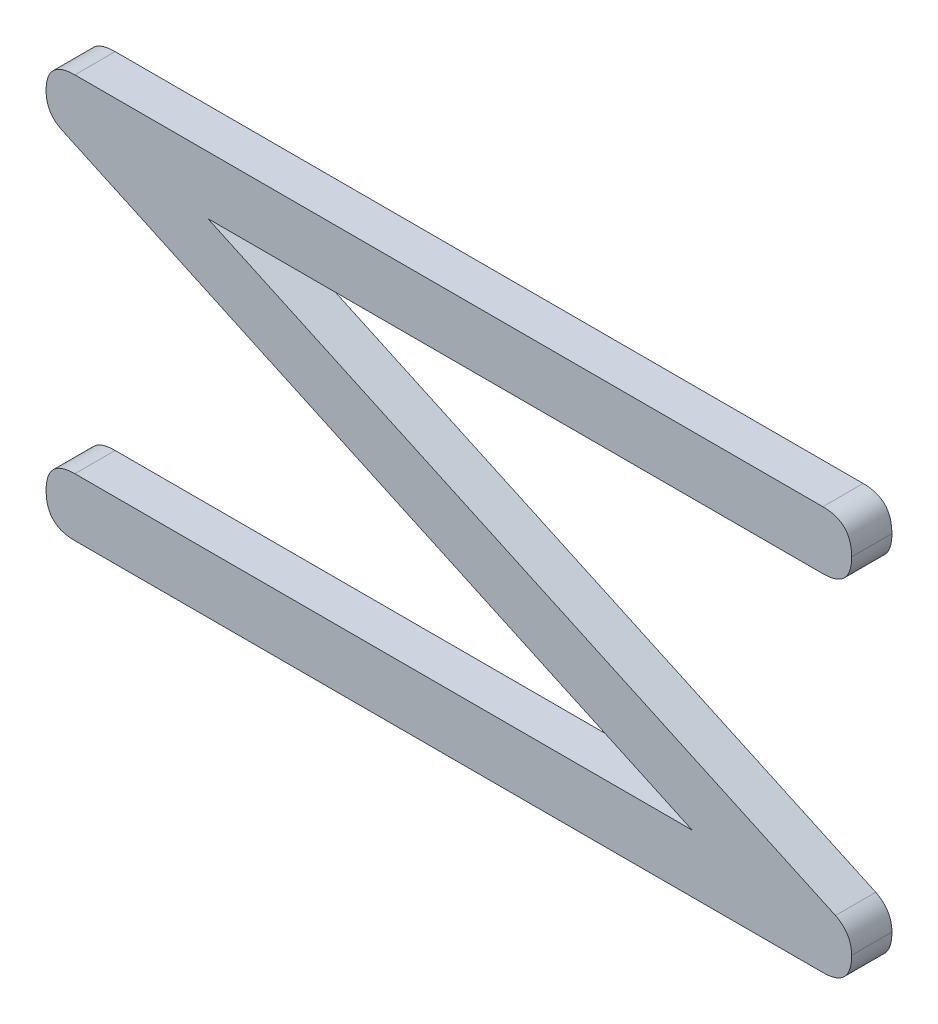
ISO-10303-21;
HEADER;
FILE_DESCRIPTION(('STEP AP214'),'2;1');
FILE_NAME('part.step','',(''),(''),'','','');
FILE_SCHEMA(('AUTOMOTIVE_DESIGN { 1 0 10303 214 1 1 1 1 }'));
ENDSEC;
DATA;
#1=APPLICATION_CONTEXT('core data for automotive mechanical design processes');
#2=APPLICATION_PROTOCOL_DEFINITION('international standard','automotive_design',2000,#1);
#3=PRODUCT_CONTEXT('',#1,'mechanical');
#4=PRODUCT('Part','Part','',(#3));
#5=PRODUCT_RELATED_PRODUCT_CATEGORY('part','',(#4));
#6=PRODUCT_DEFINITION_FORMATION('','',#4);
#7=PRODUCT_DEFINITION_CONTEXT('part definition',#1,'design');
#8=PRODUCT_DEFINITION('design','',#6,#7);
#9=PRODUCT_DEFINITION_SHAPE('','',#8);
#10=(LENGTH_UNIT() NAMED_UNIT(*) SI_UNIT(.MILLI.,.METRE.));
#11=(NAMED_UNIT(*) PLANE_ANGLE_UNIT() SI_UNIT($,.RADIAN.));
#12=(NAMED_UNIT(*) SI_UNIT($,.STERADIAN.) SOLID_ANGLE_UNIT());
#13=UNCERTAINTY_MEASURE_WITH_UNIT(LENGTH_MEASURE(1.E-05),#10,'distance_accuracy_value','');
#14=(GEOMETRIC_REPRESENTATION_CONTEXT(3) GLOBAL_UNCERTAINTY_ASSIGNED_CONTEXT((#13)) GLOBAL_UNIT_ASSIGNED_CONTEXT((#10,
#11,#12)) REPRESENTATION_CONTEXT('',''));
#15=CARTESIAN_POINT('',(0.,0.,0.));
#16=DIRECTION('',(0.,0.,1.));
#17=DIRECTION('',(1.,0.,0.));
#18=AXIS2_PLACEMENT_3D('',#15,#16,#17);
#19=CARTESIAN_POINT('',(0.8,12.2,-2.6));
#20=DIRECTION('',(0.,0.,1.));
#21=DIRECTION('',(1.,0.,0.));
#22=AXIS2_PLACEMENT_3D('',#19,#20,#21);
#23=PLANE('',#22);
#24=CARTESIAN_POINT('',(1.7014,15.6116,-2.6));
#25=CARTESIAN_POINT('',(1.63,15.6116,-2.6));
#26=CARTESIAN_POINT('',(1.63,15.5396,-2.6));
#27=B_SPLINE_CURVE_WITH_KNOTS('',2,(#24,#25,#26),.UNSPECIFIED.,.F.,.F.,(3,3),(0.,1.),.UNSPECIFIED.);
#28=CARTESIAN_POINT('',(1.7014,15.6116,-2.6));
#29=VERTEX_POINT('',#28);
#30=CARTESIAN_POINT('',(1.63,15.5396,-2.6));
#31=VERTEX_POINT('',#30);
#32=EDGE_CURVE('E180',#29,#31,#27,.T.);
#33=ORIENTED_EDGE('',*,*,#32,.T.);
#34=CARTESIAN_POINT('',(1.63,15.5396,-2.6));
#35=CARTESIAN_POINT('',(1.63,15.4676,-2.6));
#36=CARTESIAN_POINT('',(1.70145,15.4676,-2.6));
#37=B_SPLINE_CURVE_WITH_KNOTS('',2,(#34,#35,#36),.UNSPECIFIED.,.F.,.F.,(3,3),(0.,1.),.UNSPECIFIED.);
#38=CARTESIAN_POINT('',(1.70145,15.4676,-2.6));
#39=VERTEX_POINT('',#38);
#40=EDGE_CURVE('E129',#31,#39,#37,.T.);
#41=ORIENTED_EDGE('',*,*,#40,.T.);
#42=DIRECTION('',(1.,0.,0.));
#43=VECTOR('',#42,1.);
#44=CARTESIAN_POINT('',(1.70145,15.4676,-2.6));
#45=LINE('',#44,#43);
#46=CARTESIAN_POINT('',(3.55855,15.4676,-2.6));
#47=VERTEX_POINT('',#46);
#48=EDGE_CURVE('E124',#47,#39,#45,.F.);
#49=ORIENTED_EDGE('',*,*,#48,.F.);
#50=CARTESIAN_POINT('',(3.55855,15.4676,-2.6));
#51=CARTESIAN_POINT('',(3.63,15.4676,-2.6));
#52=CARTESIAN_POINT('',(3.63,15.5404,-2.6));
#53=B_SPLINE_CURVE_WITH_KNOTS('',2,(#50,#51,#52),.UNSPECIFIED.,.F.,.F.,(3,3),(0.,1.),.UNSPECIFIED.);
#54=CARTESIAN_POINT('',(3.63,15.5404,-2.6));
#55=VERTEX_POINT('',#54);
#56=EDGE_CURVE('E112',#47,#55,#53,.T.);
#57=ORIENTED_EDGE('',*,*,#56,.T.);
#58=CARTESIAN_POINT('',(3.63,15.5404,-2.6));
#59=CARTESIAN_POINT('',(3.63,15.58555,-2.6));
#60=CARTESIAN_POINT('',(3.5899,15.60595,-2.6));
#61=B_SPLINE_CURVE_WITH_KNOTS('',2,(#58,#59,#60),.UNSPECIFIED.,.F.,.F.,(3,3),(0.,1.),.UNSPECIFIED.);
#62=CARTESIAN_POINT('',(3.5899,15.60595,-2.6));
#63=VERTEX_POINT('',#62);
#64=EDGE_CURVE('E139',#55,#63,#61,.T.);
#65=ORIENTED_EDGE('',*,*,#64,.T.);
#66=DIRECTION('',(-0.907921004621455,0.419141323860065,0.));
#67=VECTOR('',#66,1.);
#68=CARTESIAN_POINT('',(3.5899,15.60595,-2.6));
#69=LINE('',#68,#67);
#70=CARTESIAN_POINT('',(2.0319,16.3252,-2.6));
#71=VERTEX_POINT('',#70);
#72=EDGE_CURVE('E230',#71,#63,#69,.F.);
#73=ORIENTED_EDGE('',*,*,#72,.F.);
#74=DIRECTION('',(1.,0.,0.));
#75=VECTOR('',#74,1.);
#76=CARTESIAN_POINT('',(2.0319,16.3252,-2.6));
#77=LINE('',#76,#75);
#78=CARTESIAN_POINT('',(3.55885,16.3252,-2.6));
#79=VERTEX_POINT('',#78);
#80=EDGE_CURVE('E227',#79,#71,#77,.F.);
#81=ORIENTED_EDGE('',*,*,#80,.F.);
#82=CARTESIAN_POINT('',(3.55885,16.3252,-2.6));
#83=CARTESIAN_POINT('',(3.63,16.3252,-2.6));
#84=CARTESIAN_POINT('',(3.63,16.3972,-2.6));
#85=B_SPLINE_CURVE_WITH_KNOTS('',2,(#82,#83,#84),.UNSPECIFIED.,.F.,.F.,(3,3),(0.,1.),.UNSPECIFIED.);
#86=CARTESIAN_POINT('',(3.63,16.3972,-2.6));
#87=VERTEX_POINT('',#86);
#88=EDGE_CURVE('E165',#79,#87,#85,.T.);
#89=ORIENTED_EDGE('',*,*,#88,.T.);
#90=CARTESIAN_POINT('',(3.63,16.3972,-2.6));
#91=CARTESIAN_POINT('',(3.63,16.4692,-2.6));
#92=CARTESIAN_POINT('',(3.55855,16.4692,-2.6));
#93=B_SPLINE_CURVE_WITH_KNOTS('',2,(#90,#91,#92),.UNSPECIFIED.,.F.,.F.,(3,3),(0.,1.),.UNSPECIFIED.);
#94=CARTESIAN_POINT('',(3.55855,16.4692,-2.6));
#95=VERTEX_POINT('',#94);
#96=EDGE_CURVE('E169',#87,#95,#93,.T.);
#97=ORIENTED_EDGE('',*,*,#96,.T.);
#98=DIRECTION('',(1.,0.,0.));
#99=VECTOR('',#98,1.);
#100=CARTESIAN_POINT('',(3.55855,16.4692,-2.6));
#101=LINE('',#100,#99);
#102=CARTESIAN_POINT('',(1.70145,16.4692,-2.6));
#103=VERTEX_POINT('',#102);
#104=EDGE_CURVE('E217',#103,#95,#101,.T.);
#105=ORIENTED_EDGE('',*,*,#104,.F.);
#106=CARTESIAN_POINT('',(1.70145,16.4692,-2.6));
#107=CARTESIAN_POINT('',(1.63,16.4692,-2.6));
#108=CARTESIAN_POINT('',(1.63,16.3992,-2.6));
#109=B_SPLINE_CURVE_WITH_KNOTS('',2,(#106,#107,#108),.UNSPECIFIED.,.F.,.F.,(3,3),(0.,1.),.UNSPECIFIED.);
#110=CARTESIAN_POINT('',(1.63,16.3992,-2.6));
#111=VERTEX_POINT('',#110);
#112=EDGE_CURVE('E172',#103,#111,#109,.T.);
#113=ORIENTED_EDGE('',*,*,#112,.T.);
#114=CARTESIAN_POINT('',(1.63,16.3992,-2.6));
#115=CARTESIAN_POINT('',(1.63,16.35205,-2.6));
#116=CARTESIAN_POINT('',(1.6714,16.33345,-2.6));
#117=B_SPLINE_CURVE_WITH_KNOTS('',2,(#114,#115,#116),.UNSPECIFIED.,.F.,.F.,(3,3),(0.,1.),.UNSPECIFIED.);
#118=CARTESIAN_POINT('',(1.6714,16.33345,-2.6));
#119=VERTEX_POINT('',#118);
#120=EDGE_CURVE('E175',#111,#119,#117,.T.);
#121=ORIENTED_EDGE('',*,*,#120,.T.);
#122=DIRECTION('',(0.907820757142358,-0.419358406260655,0.));
#123=VECTOR('',#122,1.);
#124=CARTESIAN_POINT('',(1.6714,16.33345,-2.6));
#125=LINE('',#124,#123);
#126=CARTESIAN_POINT('',(3.23405,15.6116,-2.6));
#127=VERTEX_POINT('',#126);
#128=EDGE_CURVE('E178',#127,#119,#125,.F.);
#129=ORIENTED_EDGE('',*,*,#128,.F.);
#130=DIRECTION('',(1.,0.,0.));
#131=VECTOR('',#130,1.);
#132=CARTESIAN_POINT('',(3.23405,15.6116,-2.6));
#133=LINE('',#132,#131);
#134=EDGE_CURVE('E203',#29,#127,#133,.T.);
#135=ORIENTED_EDGE('',*,*,#134,.F.);
#136=EDGE_LOOP('',(#33,#41,#49,#57,#65,#73,#81,#89,#97,#105,#113,#121,#129,#135));
#137=FACE_BOUND('',#136,.T.);
#138=ADVANCED_FACE('F17',(#137),#23,.T.);
#139=CARTESIAN_POINT('',(3.55855,15.4676,-2.7));
#140=CARTESIAN_POINT('',(3.63,15.4676,-2.7));
#141=CARTESIAN_POINT('',(3.63,15.5404,-2.7));
#142=CARTESIAN_POINT('',(3.55855,15.4676,-2.6));
#143=CARTESIAN_POINT('',(3.63,15.4676,-2.6));
#144=CARTESIAN_POINT('',(3.63,15.5404,-2.6));
#145=B_SPLINE_SURFACE_WITH_KNOTS('',1,2,((#139,#140,#141),(#142,#143,#144)),.UNSPECIFIED.,.F.,
.F.,.F.,(2,2),(3,3),(0.,1.),(0.,1.),.UNSPECIFIED.);
#146=DIRECTION('',(0.,0.,-1.));
#147=VECTOR('',#146,1.);
#148=CARTESIAN_POINT('',(3.55855,15.4676,-2.7));
#149=LINE('',#148,#147);
#150=CARTESIAN_POINT('',(3.55855,15.4676,-2.7));
#151=VERTEX_POINT('',#150);
#152=EDGE_CURVE('E116',#151,#47,#149,.F.);
#153=CARTESIAN_POINT('',(3.55855,15.4676,-2.7));
#154=CARTESIAN_POINT('',(3.63,15.4676,-2.7));
#155=CARTESIAN_POINT('',(3.63,15.5404,-2.7));
#156=B_SPLINE_CURVE_WITH_KNOTS('',2,(#153,#154,#155),.UNSPECIFIED.,.F.,.F.,(3,3),(0.,1.),.UNSPECIFIED.);
#157=CARTESIAN_POINT('',(3.63,15.5404,-2.7));
#158=VERTEX_POINT('',#157);
#159=EDGE_CURVE('E126',#151,#158,#156,.T.);
#160=DIRECTION('',(0.,0.,1.));
#161=VECTOR('',#160,1.);
#162=CARTESIAN_POINT('',(3.63,15.5404,-2.65));
#163=LINE('',#162,#161);
#164=EDGE_CURVE('E117',#158,#55,#163,.T.);
#165=ORIENTED_EDGE('',*,*,#152,.F.);
#166=ORIENTED_EDGE('',*,*,#159,.T.);
#167=ORIENTED_EDGE('',*,*,#164,.T.);
#168=ORIENTED_EDGE('',*,*,#56,.F.);
#169=EDGE_LOOP('',(#165,#166,#167,#168));
#170=FACE_BOUND('',#169,.T.);
#171=ADVANCED_FACE('F114',(#170),#145,.F.);
#172=CARTESIAN_POINT('',(3.63,15.5404,-2.7));
#173=CARTESIAN_POINT('',(3.63,15.58555,-2.7));
#174=CARTESIAN_POINT('',(3.5899,15.60595,-2.7));
#175=CARTESIAN_POINT('',(3.63,15.5404,-2.6));
#176=CARTESIAN_POINT('',(3.63,15.58555,-2.6));
#177=CARTESIAN_POINT('',(3.5899,15.60595,-2.6));
#178=B_SPLINE_SURFACE_WITH_KNOTS('',1,2,((#172,#173,#174),(#175,#176,#177)),.UNSPECIFIED.,.F.,
.F.,.F.,(2,2),(3,3),(0.,1.),(0.,1.),.UNSPECIFIED.);
#179=CARTESIAN_POINT('',(3.63,15.5404,-2.7));
#180=CARTESIAN_POINT('',(3.63,15.58555,-2.7));
#181=CARTESIAN_POINT('',(3.5899,15.60595,-2.7));
#182=B_SPLINE_CURVE_WITH_KNOTS('',2,(#179,#180,#181),.UNSPECIFIED.,.F.,.F.,(3,3),(0.,1.),.UNSPECIFIED.);
#183=CARTESIAN_POINT('',(3.5899,15.60595,-2.7));
#184=VERTEX_POINT('',#183);
#185=EDGE_CURVE('E287',#158,#184,#182,.T.);
#186=DIRECTION('',(0.,0.,1.));
#187=VECTOR('',#186,1.);
#188=CARTESIAN_POINT('',(3.5899,15.60595,-2.7));
#189=LINE('',#188,#187);
#190=EDGE_CURVE('E229',#63,#184,#189,.F.);
#191=ORIENTED_EDGE('',*,*,#164,.F.);
#192=ORIENTED_EDGE('',*,*,#185,.T.);
#193=ORIENTED_EDGE('',*,*,#190,.F.);
#194=ORIENTED_EDGE('',*,*,#64,.F.);
#195=EDGE_LOOP('',(#191,#192,#193,#194));
#196=FACE_BOUND('',#195,.T.);
#197=ADVANCED_FACE('F396',(#196),#178,.F.);
#198=CARTESIAN_POINT('',(3.5899,15.60595,-2.7));
#199=DIRECTION('',(0.419141323860065,0.907921004621455,0.));
#200=DIRECTION('',(-0.907921004621455,0.419141323860065,0.));
#201=AXIS2_PLACEMENT_3D('',#198,#199,#200);
#202=PLANE('',#201);
#203=DIRECTION('',(-0.907921004621455,0.419141323860066,0.));
#204=VECTOR('',#203,1.);
#205=CARTESIAN_POINT('',(3.5899,15.60595,-2.7));
#206=LINE('',#205,#204);
#207=CARTESIAN_POINT('',(2.0319,16.3252,-2.7));
#208=VERTEX_POINT('',#207);
#209=EDGE_CURVE('E283',#184,#208,#206,.T.);
#210=ORIENTED_EDGE('',*,*,#209,.T.);
#211=DIRECTION('',(0.,0.,-1.));
#212=VECTOR('',#211,1.);
#213=CARTESIAN_POINT('',(2.0319,16.3252,-2.7));
#214=LINE('',#213,#212);
#215=EDGE_CURVE('E224',#71,#208,#214,.T.);
#216=ORIENTED_EDGE('',*,*,#215,.F.);
#217=ORIENTED_EDGE('',*,*,#72,.T.);
#218=ORIENTED_EDGE('',*,*,#190,.T.);
#219=EDGE_LOOP('',(#210,#216,#217,#218));
#220=FACE_BOUND('',#219,.T.);
#221=ADVANCED_FACE('F151',(#220),#202,.T.);
#222=CARTESIAN_POINT('',(2.0319,16.3252,-2.7));
#223=DIRECTION('',(0.,-1.,0.));
#224=DIRECTION('',(0.,0.,-1.));
#225=AXIS2_PLACEMENT_3D('',#222,#223,#224);
#226=PLANE('',#225);
#227=DIRECTION('',(1.,0.,0.));
#228=VECTOR('',#227,1.);
#229=CARTESIAN_POINT('',(0.8,16.3252,-2.7));
#230=LINE('',#229,#228);
#231=CARTESIAN_POINT('',(3.55885,16.3252,-2.7));
#232=VERTEX_POINT('',#231);
#233=EDGE_CURVE('E279',#208,#232,#230,.T.);
#234=ORIENTED_EDGE('',*,*,#233,.T.);
#235=DIRECTION('',(0.,0.,1.));
#236=VECTOR('',#235,1.);
#237=CARTESIAN_POINT('',(3.55885,16.3252,-2.65));
#238=LINE('',#237,#236);
#239=EDGE_CURVE('E221',#232,#79,#238,.T.);
#240=ORIENTED_EDGE('',*,*,#239,.T.);
#241=ORIENTED_EDGE('',*,*,#80,.T.);
#242=ORIENTED_EDGE('',*,*,#215,.T.);
#243=EDGE_LOOP('',(#234,#240,#241,#242));
#244=FACE_BOUND('',#243,.T.);
#245=ADVANCED_FACE('F394',(#244),#226,.T.);
#246=CARTESIAN_POINT('',(3.55885,16.3252,-2.7));
#247=CARTESIAN_POINT('',(3.63,16.3252,-2.7));
#248=CARTESIAN_POINT('',(3.63,16.3972,-2.7));
#249=CARTESIAN_POINT('',(3.55885,16.3252,-2.6));
#250=CARTESIAN_POINT('',(3.63,16.3252,-2.6));
#251=CARTESIAN_POINT('',(3.63,16.3972,-2.6));
#252=B_SPLINE_SURFACE_WITH_KNOTS('',1,2,((#246,#247,#248),(#249,#250,#251)),.UNSPECIFIED.,.F.,
.F.,.F.,(2,2),(3,3),(0.,1.),(0.,1.),.UNSPECIFIED.);
#253=CARTESIAN_POINT('',(3.55885,16.3252,-2.7));
#254=CARTESIAN_POINT('',(3.63,16.3252,-2.7));
#255=CARTESIAN_POINT('',(3.63,16.3972,-2.7));
#256=B_SPLINE_CURVE_WITH_KNOTS('',2,(#253,#254,#255),.UNSPECIFIED.,.F.,.F.,(3,3),(0.,1.),.UNSPECIFIED.);
#257=CARTESIAN_POINT('',(3.63,16.3972,-2.7));
#258=VERTEX_POINT('',#257);
#259=EDGE_CURVE('E282',#232,#258,#256,.T.);
#260=DIRECTION('',(0.,0.,1.));
#261=VECTOR('',#260,1.);
#262=CARTESIAN_POINT('',(3.63,16.3972,-2.65));
#263=LINE('',#262,#261);
#264=EDGE_CURVE('E218',#258,#87,#263,.T.);
#265=ORIENTED_EDGE('',*,*,#239,.F.);
#266=ORIENTED_EDGE('',*,*,#259,.T.);
#267=ORIENTED_EDGE('',*,*,#264,.T.);
#268=ORIENTED_EDGE('',*,*,#88,.F.);
#269=EDGE_LOOP('',(#265,#266,#267,#268));
#270=FACE_BOUND('',#269,.T.);
#271=ADVANCED_FACE('F384',(#270),#252,.F.);
#272=CARTESIAN_POINT('',(3.63,16.3972,-2.7));
#273=CARTESIAN_POINT('',(3.63,16.4692,-2.7));
#274=CARTESIAN_POINT('',(3.55855,16.4692,-2.7));
#275=CARTESIAN_POINT('',(3.63,16.3972,-2.6));
#276=CARTESIAN_POINT('',(3.63,16.4692,-2.6));
#277=CARTESIAN_POINT('',(3.55855,16.4692,-2.6));
#278=B_SPLINE_SURFACE_WITH_KNOTS('',1,2,((#272,#273,#274),(#275,#276,#277)),.UNSPECIFIED.,.F.,
.F.,.F.,(2,2),(3,3),(0.,1.),(0.,1.),.UNSPECIFIED.);
#279=CARTESIAN_POINT('',(3.63,16.3972,-2.7));
#280=CARTESIAN_POINT('',(3.63,16.4692,-2.7));
#281=CARTESIAN_POINT('',(3.55855,16.4692,-2.7));
#282=B_SPLINE_CURVE_WITH_KNOTS('',2,(#279,#280,#281),.UNSPECIFIED.,.F.,.F.,(3,3),(0.,1.),.UNSPECIFIED.);
#283=CARTESIAN_POINT('',(3.55855,16.4692,-2.7));
#284=VERTEX_POINT('',#283);
#285=EDGE_CURVE('E278',#258,#284,#282,.T.);
#286=DIRECTION('',(0.,0.,1.));
#287=VECTOR('',#286,1.);
#288=CARTESIAN_POINT('',(3.55855,16.4692,-2.7));
#289=LINE('',#288,#287);
#290=EDGE_CURVE('E215',#95,#284,#289,.F.);
#291=ORIENTED_EDGE('',*,*,#264,.F.);
#292=ORIENTED_EDGE('',*,*,#285,.T.);
#293=ORIENTED_EDGE('',*,*,#290,.F.);
#294=ORIENTED_EDGE('',*,*,#96,.F.);
#295=EDGE_LOOP('',(#291,#292,#293,#294));
#296=FACE_BOUND('',#295,.T.);
#297=ADVANCED_FACE('F374',(#296),#278,.F.);
#298=CARTESIAN_POINT('',(3.55855,16.4692,-2.7));
#299=DIRECTION('',(0.,1.,0.));
#300=DIRECTION('',(0.,0.,1.));
#301=AXIS2_PLACEMENT_3D('',#298,#299,#300);
#302=PLANE('',#301);
#303=DIRECTION('',(1.,0.,0.));
#304=VECTOR('',#303,1.);
#305=CARTESIAN_POINT('',(0.8,16.4692,-2.7));
#306=LINE('',#305,#304);
#307=CARTESIAN_POINT('',(1.70145,16.4692,-2.7));
#308=VERTEX_POINT('',#307);
#309=EDGE_CURVE('E275',#284,#308,#306,.F.);
#310=ORIENTED_EDGE('',*,*,#309,.T.);
#311=DIRECTION('',(0.,0.,1.));
#312=VECTOR('',#311,1.);
#313=CARTESIAN_POINT('',(1.70145,16.4692,-2.65));
#314=LINE('',#313,#312);
#315=EDGE_CURVE('E212',#308,#103,#314,.T.);
#316=ORIENTED_EDGE('',*,*,#315,.T.);
#317=ORIENTED_EDGE('',*,*,#104,.T.);
#318=ORIENTED_EDGE('',*,*,#290,.T.);
#319=EDGE_LOOP('',(#310,#316,#317,#318));
#320=FACE_BOUND('',#319,.T.);
#321=ADVANCED_FACE('F372',(#320),#302,.T.);
#322=CARTESIAN_POINT('',(1.70145,16.4692,-2.7));
#323=CARTESIAN_POINT('',(1.63,16.4692,-2.7));
#324=CARTESIAN_POINT('',(1.63,16.3992,-2.7));
#325=CARTESIAN_POINT('',(1.70145,16.4692,-2.6));
#326=CARTESIAN_POINT('',(1.63,16.4692,-2.6));
#327=CARTESIAN_POINT('',(1.63,16.3992,-2.6));
#328=B_SPLINE_SURFACE_WITH_KNOTS('',1,2,((#322,#323,#324),(#325,#326,#327)),.UNSPECIFIED.,.F.,
.F.,.F.,(2,2),(3,3),(0.,1.),(0.,1.),.UNSPECIFIED.);
#329=CARTESIAN_POINT('',(1.70145,16.4692,-2.7));
#330=CARTESIAN_POINT('',(1.63,16.4692,-2.7));
#331=CARTESIAN_POINT('',(1.63,16.3992,-2.7));
#332=B_SPLINE_CURVE_WITH_KNOTS('',2,(#329,#330,#331),.UNSPECIFIED.,.F.,.F.,(3,3),(0.,1.),.UNSPECIFIED.);
#333=CARTESIAN_POINT('',(1.63,16.3992,-2.7));
#334=VERTEX_POINT('',#333);
#335=EDGE_CURVE('E268',#308,#334,#332,.T.);
#336=DIRECTION('',(0.,0.,1.));
#337=VECTOR('',#336,1.);
#338=CARTESIAN_POINT('',(1.63,16.3992,-2.65));
#339=LINE('',#338,#337);
#340=EDGE_CURVE('E179',#334,#111,#339,.T.);
#341=ORIENTED_EDGE('',*,*,#315,.F.);
#342=ORIENTED_EDGE('',*,*,#335,.T.);
#343=ORIENTED_EDGE('',*,*,#340,.T.);
#344=ORIENTED_EDGE('',*,*,#112,.F.);
#345=EDGE_LOOP('',(#341,#342,#343,#344));
#346=FACE_BOUND('',#345,.T.);
#347=ADVANCED_FACE('F361',(#346),#328,.F.);
#348=CARTESIAN_POINT('',(1.63,16.3992,-2.7));
#349=CARTESIAN_POINT('',(1.63,16.35205,-2.7));
#350=CARTESIAN_POINT('',(1.6714,16.33345,-2.7));
#351=CARTESIAN_POINT('',(1.63,16.3992,-2.6));
#352=CARTESIAN_POINT('',(1.63,16.35205,-2.6));
#353=CARTESIAN_POINT('',(1.6714,16.33345,-2.6));
#354=B_SPLINE_SURFACE_WITH_KNOTS('',1,2,((#348,#349,#350),(#351,#352,#353)),.UNSPECIFIED.,.F.,
.F.,.F.,(2,2),(3,3),(0.,1.),(0.,1.),.UNSPECIFIED.);
#355=CARTESIAN_POINT('',(1.63,16.3992,-2.7));
#356=CARTESIAN_POINT('',(1.63,16.35205,-2.7));
#357=CARTESIAN_POINT('',(1.6714,16.33345,-2.7));
#358=B_SPLINE_CURVE_WITH_KNOTS('',2,(#355,#356,#357),.UNSPECIFIED.,.F.,.F.,(3,3),(0.,1.),.UNSPECIFIED.);
#359=CARTESIAN_POINT('',(1.6714,16.33345,-2.7));
#360=VERTEX_POINT('',#359);
#361=EDGE_CURVE('E264',#334,#360,#358,.T.);
#362=DIRECTION('',(0.,0.,1.));
#363=VECTOR('',#362,1.);
#364=CARTESIAN_POINT('',(1.6714,16.33345,-2.7));
#365=LINE('',#364,#363);
#366=EDGE_CURVE('E208',#119,#360,#365,.F.);
#367=ORIENTED_EDGE('',*,*,#340,.F.);
#368=ORIENTED_EDGE('',*,*,#361,.T.);
#369=ORIENTED_EDGE('',*,*,#366,.F.);
#370=ORIENTED_EDGE('',*,*,#120,.F.);
#371=EDGE_LOOP('',(#367,#368,#369,#370));
#372=FACE_BOUND('',#371,.T.);
#373=ADVANCED_FACE('F351',(#372),#354,.F.);
#374=CARTESIAN_POINT('',(1.6714,16.33345,-2.7));
#375=DIRECTION('',(-0.419358406260655,-0.907820757142358,0.));
#376=DIRECTION('',(0.907820757142358,-0.419358406260655,0.));
#377=AXIS2_PLACEMENT_3D('',#374,#375,#376);
#378=PLANE('',#377);
#379=DIRECTION('',(0.907820757142358,-0.419358406260654,0.));
#380=VECTOR('',#379,1.);
#381=CARTESIAN_POINT('',(1.6714,16.33345,-2.7));
#382=LINE('',#381,#380);
#383=CARTESIAN_POINT('',(3.23405,15.6116,-2.7));
#384=VERTEX_POINT('',#383);
#385=EDGE_CURVE('E258',#360,#384,#382,.T.);
#386=ORIENTED_EDGE('',*,*,#385,.T.);
#387=DIRECTION('',(0.,0.,1.));
#388=VECTOR('',#387,1.);
#389=CARTESIAN_POINT('',(3.23405,15.6116,-2.7));
#390=LINE('',#389,#388);
#391=EDGE_CURVE('E197',#127,#384,#390,.F.);
#392=ORIENTED_EDGE('',*,*,#391,.F.);
#393=ORIENTED_EDGE('',*,*,#128,.T.);
#394=ORIENTED_EDGE('',*,*,#366,.T.);
#395=EDGE_LOOP('',(#386,#392,#393,#394));
#396=FACE_BOUND('',#395,.T.);
#397=ADVANCED_FACE('F256',(#396),#378,.T.);
#398=CARTESIAN_POINT('',(3.23405,15.6116,-2.7));
#399=DIRECTION('',(0.,1.,0.));
#400=DIRECTION('',(0.,0.,1.));
#401=AXIS2_PLACEMENT_3D('',#398,#399,#400);
#402=PLANE('',#401);
#403=DIRECTION('',(1.,0.,0.));
#404=VECTOR('',#403,1.);
#405=CARTESIAN_POINT('',(0.8,15.6116,-2.7));
#406=LINE('',#405,#404);
#407=CARTESIAN_POINT('',(1.7014,15.6116,-2.7));
#408=VERTEX_POINT('',#407);
#409=EDGE_CURVE('E263',#384,#408,#406,.F.);
#410=ORIENTED_EDGE('',*,*,#409,.T.);
#411=DIRECTION('',(0.,0.,1.));
#412=VECTOR('',#411,1.);
#413=CARTESIAN_POINT('',(1.7014,15.6116,-2.65));
#414=LINE('',#413,#412);
#415=EDGE_CURVE('E187',#408,#29,#414,.T.);
#416=ORIENTED_EDGE('',*,*,#415,.T.);
#417=ORIENTED_EDGE('',*,*,#134,.T.);
#418=ORIENTED_EDGE('',*,*,#391,.T.);
#419=EDGE_LOOP('',(#410,#416,#417,#418));
#420=FACE_BOUND('',#419,.T.);
#421=ADVANCED_FACE('F248',(#420),#402,.T.);
#422=CARTESIAN_POINT('',(1.7014,15.6116,-2.7));
#423=CARTESIAN_POINT('',(1.63,15.6116,-2.7));
#424=CARTESIAN_POINT('',(1.63,15.5396,-2.7));
#425=CARTESIAN_POINT('',(1.7014,15.6116,-2.6));
#426=CARTESIAN_POINT('',(1.63,15.6116,-2.6));
#427=CARTESIAN_POINT('',(1.63,15.5396,-2.6));
#428=B_SPLINE_SURFACE_WITH_KNOTS('',1,2,((#422,#423,#424),(#425,#426,#427)),.UNSPECIFIED.,.F.,
.F.,.F.,(2,2),(3,3),(0.,1.),(0.,1.),.UNSPECIFIED.);
#429=CARTESIAN_POINT('',(1.7014,15.6116,-2.7));
#430=CARTESIAN_POINT('',(1.63,15.6116,-2.7));
#431=CARTESIAN_POINT('',(1.63,15.5396,-2.7));
#432=B_SPLINE_CURVE_WITH_KNOTS('',2,(#429,#430,#431),.UNSPECIFIED.,.F.,.F.,(3,3),(0.,1.),.UNSPECIFIED.);
#433=CARTESIAN_POINT('',(1.63,15.5396,-2.7));
#434=VERTEX_POINT('',#433);
#435=EDGE_CURVE('E266',#408,#434,#432,.T.);
#436=DIRECTION('',(0.,0.,1.));
#437=VECTOR('',#436,1.);
#438=CARTESIAN_POINT('',(1.63,15.5396,-2.65));
#439=LINE('',#438,#437);
#440=EDGE_CURVE('E132',#434,#31,#439,.T.);
#441=ORIENTED_EDGE('',*,*,#415,.F.);
#442=ORIENTED_EDGE('',*,*,#435,.T.);
#443=ORIENTED_EDGE('',*,*,#440,.T.);
#444=ORIENTED_EDGE('',*,*,#32,.F.);
#445=EDGE_LOOP('',(#441,#442,#443,#444));
#446=FACE_BOUND('',#445,.T.);
#447=ADVANCED_FACE('F341',(#446),#428,.F.);
#448=CARTESIAN_POINT('',(1.63,15.5396,-2.7));
#449=CARTESIAN_POINT('',(1.63,15.4676,-2.7));
#450=CARTESIAN_POINT('',(1.70145,15.4676,-2.7));
#451=CARTESIAN_POINT('',(1.63,15.5396,-2.6));
#452=CARTESIAN_POINT('',(1.63,15.4676,-2.6));
#453=CARTESIAN_POINT('',(1.70145,15.4676,-2.6));
#454=B_SPLINE_SURFACE_WITH_KNOTS('',1,2,((#448,#449,#450),(#451,#452,#453)),.UNSPECIFIED.,.F.,
.F.,.F.,(2,2),(3,3),(0.,1.),(0.,1.),.UNSPECIFIED.);
#455=CARTESIAN_POINT('',(1.63,15.5396,-2.7));
#456=CARTESIAN_POINT('',(1.63,15.4676,-2.7));
#457=CARTESIAN_POINT('',(1.70145,15.4676,-2.7));
#458=B_SPLINE_CURVE_WITH_KNOTS('',2,(#455,#456,#457),.UNSPECIFIED.,.F.,.F.,(3,3),(0.,1.),.UNSPECIFIED.);
#459=CARTESIAN_POINT('',(1.70145,15.4676,-2.7));
#460=VERTEX_POINT('',#459);
#461=EDGE_CURVE('E29',#434,#460,#458,.T.);
#462=DIRECTION('',(0.,0.,-1.));
#463=VECTOR('',#462,1.);
#464=CARTESIAN_POINT('',(1.70145,15.4676,-2.7));
#465=LINE('',#464,#463);
#466=EDGE_CURVE('E37',#39,#460,#465,.T.);
#467=ORIENTED_EDGE('',*,*,#440,.F.);
#468=ORIENTED_EDGE('',*,*,#461,.T.);
#469=ORIENTED_EDGE('',*,*,#466,.F.);
#470=ORIENTED_EDGE('',*,*,#40,.F.);
#471=EDGE_LOOP('',(#467,#468,#469,#470));
#472=FACE_BOUND('',#471,.T.);
#473=ADVANCED_FACE('F19',(#472),#454,.F.);
#474=CARTESIAN_POINT('',(1.70145,15.4676,-2.7));
#475=DIRECTION('',(0.,-1.,0.));
#476=DIRECTION('',(0.,0.,-1.));
#477=AXIS2_PLACEMENT_3D('',#474,#475,#476);
#478=PLANE('',#477);
#479=DIRECTION('',(1.,0.,0.));
#480=VECTOR('',#479,1.);
#481=CARTESIAN_POINT('',(0.8,15.4676,-2.7));
#482=LINE('',#481,#480);
#483=EDGE_CURVE('E11',#460,#151,#482,.T.);
#484=ORIENTED_EDGE('',*,*,#483,.T.);
#485=ORIENTED_EDGE('',*,*,#152,.T.);
#486=ORIENTED_EDGE('',*,*,#48,.T.);
#487=ORIENTED_EDGE('',*,*,#466,.T.);
#488=EDGE_LOOP('',(#484,#485,#486,#487));
#489=FACE_BOUND('',#488,.T.);
#490=ADVANCED_FACE('F123',(#489),#478,.T.);
#491=CARTESIAN_POINT('',(0.8,12.2,-2.7));
#492=DIRECTION('',(0.,0.,1.));
#493=DIRECTION('',(1.,0.,0.));
#494=AXIS2_PLACEMENT_3D('',#491,#492,#493);
#495=PLANE('',#494);
#496=ORIENTED_EDGE('',*,*,#461,.F.);
#497=ORIENTED_EDGE('',*,*,#435,.F.);
#498=ORIENTED_EDGE('',*,*,#409,.F.);
#499=ORIENTED_EDGE('',*,*,#385,.F.);
#500=ORIENTED_EDGE('',*,*,#361,.F.);
#501=ORIENTED_EDGE('',*,*,#335,.F.);
#502=ORIENTED_EDGE('',*,*,#309,.F.);
#503=ORIENTED_EDGE('',*,*,#285,.F.);
#504=ORIENTED_EDGE('',*,*,#259,.F.);
#505=ORIENTED_EDGE('',*,*,#233,.F.);
#506=ORIENTED_EDGE('',*,*,#209,.F.);
#507=ORIENTED_EDGE('',*,*,#185,.F.);
#508=ORIENTED_EDGE('',*,*,#159,.F.);
#509=ORIENTED_EDGE('',*,*,#483,.F.);
#510=EDGE_LOOP('',(#496,#497,#498,#499,#500,#501,#502,#503,#504,#505,#506,#507,#508,#509));
#511=FACE_BOUND('',#510,.T.);
#512=ADVANCED_FACE('F300',(#511),#495,.F.);
#513=CLOSED_SHELL('',(#138,#171,#197,#221,#245,#271,#297,#321,#347,#373,#397,#421,#447,#473,
#490,#512));
#514=MANIFOLD_SOLID_BREP('B1',#513);
#515=ADVANCED_BREP_SHAPE_REPRESENTATION('',(#18,#514),#14);
#516=SHAPE_DEFINITION_REPRESENTATION(#9,#515);
ENDSEC;
END-ISO-10303-21;
